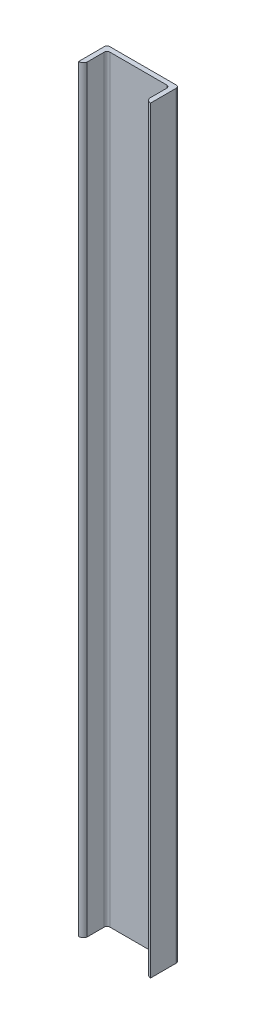
ISO-10303-21;
HEADER;
FILE_DESCRIPTION(('STEP AP214'),'2;1');
FILE_NAME('part.step','',(''),(''),'','','');
FILE_SCHEMA(('AUTOMOTIVE_DESIGN { 1 0 10303 214 1 1 1 1 }'));
ENDSEC;
DATA;
#1=APPLICATION_CONTEXT('core data for automotive mechanical design processes');
#2=APPLICATION_PROTOCOL_DEFINITION('international standard','automotive_design',2000,#1);
#3=PRODUCT_CONTEXT('',#1,'mechanical');
#4=PRODUCT('Part','Part','',(#3));
#5=PRODUCT_RELATED_PRODUCT_CATEGORY('part','',(#4));
#6=PRODUCT_DEFINITION_FORMATION('','',#4);
#7=PRODUCT_DEFINITION_CONTEXT('part definition',#1,'design');
#8=PRODUCT_DEFINITION('design','',#6,#7);
#9=PRODUCT_DEFINITION_SHAPE('','',#8);
#10=(LENGTH_UNIT() NAMED_UNIT(*) SI_UNIT(.MILLI.,.METRE.));
#11=(NAMED_UNIT(*) PLANE_ANGLE_UNIT() SI_UNIT($,.RADIAN.));
#12=(NAMED_UNIT(*) SI_UNIT($,.STERADIAN.) SOLID_ANGLE_UNIT());
#13=UNCERTAINTY_MEASURE_WITH_UNIT(LENGTH_MEASURE(1.E-05),#10,'distance_accuracy_value','');
#14=(GEOMETRIC_REPRESENTATION_CONTEXT(3) GLOBAL_UNCERTAINTY_ASSIGNED_CONTEXT((#13)) GLOBAL_UNIT_ASSIGNED_CONTEXT((#10,
#11,#12)) REPRESENTATION_CONTEXT('',''));
#15=CARTESIAN_POINT('',(0.,0.,0.));
#16=DIRECTION('',(0.,0.,1.));
#17=DIRECTION('',(1.,0.,0.));
#18=AXIS2_PLACEMENT_3D('',#15,#16,#17);
#19=CARTESIAN_POINT('',(38.,800.,-12.1871044980327));
#20=DIRECTION('',(0.,0.,1.));
#21=DIRECTION('',(1.,0.,0.));
#22=AXIS2_PLACEMENT_3D('',#19,#20,#21);
#23=PLANE('',#22);
#24=DIRECTION('',(-1.,0.,0.));
#25=VECTOR('',#24,1.);
#26=CARTESIAN_POINT('',(38.,800.,-12.1871044980327));
#27=LINE('',#26,#25);
#28=CARTESIAN_POINT('',(35.,800.,-12.1871044980327));
#29=VERTEX_POINT('',#28);
#30=CARTESIAN_POINT('',(-35.,800.,-12.1871044980327));
#31=VERTEX_POINT('',#30);
#32=EDGE_CURVE('E131',#29,#31,#27,.T.);
#33=ORIENTED_EDGE('',*,*,#32,.F.);
#34=DIRECTION('',(0.,-1.,0.));
#35=VECTOR('',#34,1.);
#36=CARTESIAN_POINT('',(35.,800.,-12.1871044980327));
#37=LINE('',#36,#35);
#38=CARTESIAN_POINT('',(35.,0.,-12.1871044980327));
#39=VERTEX_POINT('',#38);
#40=EDGE_CURVE('E196',#29,#39,#37,.T.);
#41=ORIENTED_EDGE('',*,*,#40,.T.);
#42=DIRECTION('',(-1.,0.,0.));
#43=VECTOR('',#42,1.);
#44=CARTESIAN_POINT('',(38.,0.,-12.1871044980327));
#45=LINE('',#44,#43);
#46=CARTESIAN_POINT('',(-35.,0.,-12.1871044980327));
#47=VERTEX_POINT('',#46);
#48=EDGE_CURVE('E161',#39,#47,#45,.T.);
#49=ORIENTED_EDGE('',*,*,#48,.T.);
#50=DIRECTION('',(0.,-1.,0.));
#51=VECTOR('',#50,1.);
#52=CARTESIAN_POINT('',(-35.,800.,-12.1871044980327));
#53=LINE('',#52,#51);
#54=EDGE_CURVE('E194',#47,#31,#53,.F.);
#55=ORIENTED_EDGE('',*,*,#54,.T.);
#56=EDGE_LOOP('',(#33,#41,#49,#55));
#57=FACE_BOUND('',#56,.T.);
#58=ADVANCED_FACE('F33',(#57),#23,.F.);
#59=CARTESIAN_POINT('',(-38.,800.,-12.1871044980327));
#60=DIRECTION('',(1.,0.,0.));
#61=DIRECTION('',(0.,0.,-1.));
#62=AXIS2_PLACEMENT_3D('',#59,#60,#61);
#63=PLANE('',#62);
#64=DIRECTION('',(0.,0.,1.));
#65=VECTOR('',#64,1.);
#66=CARTESIAN_POINT('',(-38.,800.,-12.1871044980327));
#67=LINE('',#66,#65);
#68=CARTESIAN_POINT('',(-38.,800.,-9.18710449803274));
#69=VERTEX_POINT('',#68);
#70=CARTESIAN_POINT('',(-38.,800.,17.8128955019673));
#71=VERTEX_POINT('',#70);
#72=EDGE_CURVE('E121',#69,#71,#67,.T.);
#73=ORIENTED_EDGE('',*,*,#72,.F.);
#74=DIRECTION('',(0.,-1.,0.));
#75=VECTOR('',#74,1.);
#76=CARTESIAN_POINT('',(-38.,800.,-9.18710449803274));
#77=LINE('',#76,#75);
#78=CARTESIAN_POINT('',(-38.,0.,-9.18710449803274));
#79=VERTEX_POINT('',#78);
#80=EDGE_CURVE('E207',#69,#79,#77,.T.);
#81=ORIENTED_EDGE('',*,*,#80,.T.);
#82=DIRECTION('',(0.,0.,1.));
#83=VECTOR('',#82,1.);
#84=CARTESIAN_POINT('',(-38.,0.,-12.1871044980327));
#85=LINE('',#84,#83);
#86=CARTESIAN_POINT('',(-38.,0.,17.8128955019673));
#87=VERTEX_POINT('',#86);
#88=EDGE_CURVE('E137',#79,#87,#85,.T.);
#89=ORIENTED_EDGE('',*,*,#88,.T.);
#90=DIRECTION('',(0.,-1.,0.));
#91=VECTOR('',#90,1.);
#92=CARTESIAN_POINT('',(-38.,800.,17.8128955019673));
#93=LINE('',#92,#91);
#94=EDGE_CURVE('E134',#71,#87,#93,.T.);
#95=ORIENTED_EDGE('',*,*,#94,.F.);
#96=EDGE_LOOP('',(#73,#81,#89,#95));
#97=FACE_BOUND('',#96,.T.);
#98=ADVANCED_FACE('F135',(#97),#63,.F.);
#99=CARTESIAN_POINT('',(-38.,800.,12.6822359612341));
#100=DIRECTION('',(0.,-1.,0.));
#101=DIRECTION('',(0.,0.,-1.));
#102=AXIS2_PLACEMENT_3D('',#99,#100,#101);
#103=CYLINDRICAL_SURFACE('',#102,5.13065954073313);
#104=CARTESIAN_POINT('',(-38.,0.,12.6822359612341));
#105=DIRECTION('',(0.,1.,0.));
#106=DIRECTION('',(0.,0.,1.));
#107=AXIS2_PLACEMENT_3D('',#104,#105,#106);
#108=CIRCLE('',#107,5.13065954073313);
#109=CARTESIAN_POINT('',(-33.,0.,13.8327433809911));
#110=VERTEX_POINT('',#109);
#111=EDGE_CURVE('E165',#87,#110,#108,.T.);
#112=ORIENTED_EDGE('',*,*,#111,.T.);
#113=DIRECTION('',(0.,-1.,0.));
#114=VECTOR('',#113,1.);
#115=CARTESIAN_POINT('',(-33.,800.,13.8327433809911));
#116=LINE('',#115,#114);
#117=CARTESIAN_POINT('',(-33.,800.,13.8327433809911));
#118=VERTEX_POINT('',#117);
#119=EDGE_CURVE('E141',#118,#110,#116,.T.);
#120=ORIENTED_EDGE('',*,*,#119,.F.);
#121=CARTESIAN_POINT('',(-38.,800.,12.6822359612341));
#122=DIRECTION('',(0.,1.,0.));
#123=DIRECTION('',(0.,0.,1.));
#124=AXIS2_PLACEMENT_3D('',#121,#122,#123);
#125=CIRCLE('',#124,5.13065954073313);
#126=EDGE_CURVE('E126',#71,#118,#125,.T.);
#127=ORIENTED_EDGE('',*,*,#126,.F.);
#128=ORIENTED_EDGE('',*,*,#94,.T.);
#129=EDGE_LOOP('',(#112,#120,#127,#128));
#130=FACE_BOUND('',#129,.T.);
#131=ADVANCED_FACE('F143',(#130),#103,.T.);
#132=CARTESIAN_POINT('',(-33.,800.,13.8327433809911));
#133=DIRECTION('',(-1.,0.,0.));
#134=DIRECTION('',(0.,0.,1.));
#135=AXIS2_PLACEMENT_3D('',#132,#133,#134);
#136=PLANE('',#135);
#137=DIRECTION('',(0.,0.,-1.));
#138=VECTOR('',#137,1.);
#139=CARTESIAN_POINT('',(-33.,0.,13.8327433809911));
#140=LINE('',#139,#138);
#141=CARTESIAN_POINT('',(-33.,0.,-4.18710449803152));
#142=VERTEX_POINT('',#141);
#143=EDGE_CURVE('E167',#110,#142,#140,.T.);
#144=ORIENTED_EDGE('',*,*,#143,.T.);
#145=DIRECTION('',(0.,-1.,0.));
#146=VECTOR('',#145,1.);
#147=CARTESIAN_POINT('',(-33.,800.,-4.18710449803152));
#148=LINE('',#147,#146);
#149=CARTESIAN_POINT('',(-33.,800.,-4.18710449803152));
#150=VERTEX_POINT('',#149);
#151=EDGE_CURVE('E189',#142,#150,#148,.F.);
#152=ORIENTED_EDGE('',*,*,#151,.T.);
#153=DIRECTION('',(0.,0.,-1.));
#154=VECTOR('',#153,1.);
#155=CARTESIAN_POINT('',(-33.,800.,13.8327433809911));
#156=LINE('',#155,#154);
#157=EDGE_CURVE('E146',#118,#150,#156,.T.);
#158=ORIENTED_EDGE('',*,*,#157,.F.);
#159=ORIENTED_EDGE('',*,*,#119,.T.);
#160=EDGE_LOOP('',(#144,#152,#158,#159));
#161=FACE_BOUND('',#160,.T.);
#162=ADVANCED_FACE('F326',(#161),#136,.F.);
#163=CARTESIAN_POINT('',(33.,800.,-7.18710449803152));
#164=DIRECTION('',(0.,0.,-1.));
#165=DIRECTION('',(-1.,0.,0.));
#166=AXIS2_PLACEMENT_3D('',#163,#164,#165);
#167=PLANE('',#166);
#168=DIRECTION('',(1.,0.,0.));
#169=VECTOR('',#168,1.);
#170=CARTESIAN_POINT('',(33.,800.,-7.18710449803152));
#171=LINE('',#170,#169);
#172=CARTESIAN_POINT('',(-30.,800.,-7.18710449803152));
#173=VERTEX_POINT('',#172);
#174=CARTESIAN_POINT('',(30.,800.,-7.18710449803152));
#175=VERTEX_POINT('',#174);
#176=EDGE_CURVE('E148',#173,#175,#171,.T.);
#177=ORIENTED_EDGE('',*,*,#176,.F.);
#178=DIRECTION('',(0.,-1.,0.));
#179=VECTOR('',#178,1.);
#180=CARTESIAN_POINT('',(-30.,0.,-7.18710449803152));
#181=LINE('',#180,#179);
#182=CARTESIAN_POINT('',(-30.,0.,-7.18710449803152));
#183=VERTEX_POINT('',#182);
#184=EDGE_CURVE('E186',#173,#183,#181,.T.);
#185=ORIENTED_EDGE('',*,*,#184,.T.);
#186=DIRECTION('',(1.,0.,0.));
#187=VECTOR('',#186,1.);
#188=CARTESIAN_POINT('',(33.,0.,-7.18710449803152));
#189=LINE('',#188,#187);
#190=CARTESIAN_POINT('',(30.,0.,-7.18710449803152));
#191=VERTEX_POINT('',#190);
#192=EDGE_CURVE('E170',#183,#191,#189,.T.);
#193=ORIENTED_EDGE('',*,*,#192,.T.);
#194=DIRECTION('',(0.,-1.,0.));
#195=VECTOR('',#194,1.);
#196=CARTESIAN_POINT('',(30.,800.,-7.18710449803152));
#197=LINE('',#196,#195);
#198=EDGE_CURVE('E140',#191,#175,#197,.F.);
#199=ORIENTED_EDGE('',*,*,#198,.T.);
#200=EDGE_LOOP('',(#177,#185,#193,#199));
#201=FACE_BOUND('',#200,.T.);
#202=ADVANCED_FACE('F223',(#201),#167,.F.);
#203=CARTESIAN_POINT('',(33.,800.,13.8327433809911));
#204=DIRECTION('',(1.,0.,0.));
#205=DIRECTION('',(0.,0.,-1.));
#206=AXIS2_PLACEMENT_3D('',#203,#204,#205);
#207=PLANE('',#206);
#208=DIRECTION('',(0.,0.,1.));
#209=VECTOR('',#208,1.);
#210=CARTESIAN_POINT('',(33.,800.,13.8327433809911));
#211=LINE('',#210,#209);
#212=CARTESIAN_POINT('',(33.,800.,-4.18710449803152));
#213=VERTEX_POINT('',#212);
#214=CARTESIAN_POINT('',(33.,800.,13.8327433809911));
#215=VERTEX_POINT('',#214);
#216=EDGE_CURVE('E154',#213,#215,#211,.T.);
#217=ORIENTED_EDGE('',*,*,#216,.F.);
#218=DIRECTION('',(0.,-1.,0.));
#219=VECTOR('',#218,1.);
#220=CARTESIAN_POINT('',(33.,0.,-4.18710449803152));
#221=LINE('',#220,#219);
#222=CARTESIAN_POINT('',(33.,0.,-4.18710449803152));
#223=VERTEX_POINT('',#222);
#224=EDGE_CURVE('E191',#213,#223,#221,.T.);
#225=ORIENTED_EDGE('',*,*,#224,.T.);
#226=DIRECTION('',(0.,0.,1.));
#227=VECTOR('',#226,1.);
#228=CARTESIAN_POINT('',(33.,0.,13.8327433809911));
#229=LINE('',#228,#227);
#230=CARTESIAN_POINT('',(33.,0.,13.8327433809911));
#231=VERTEX_POINT('',#230);
#232=EDGE_CURVE('E173',#223,#231,#229,.T.);
#233=ORIENTED_EDGE('',*,*,#232,.T.);
#234=DIRECTION('',(0.,-1.,0.));
#235=VECTOR('',#234,1.);
#236=CARTESIAN_POINT('',(33.,800.,13.8327433809911));
#237=LINE('',#236,#235);
#238=EDGE_CURVE('E181',#215,#231,#237,.T.);
#239=ORIENTED_EDGE('',*,*,#238,.F.);
#240=EDGE_LOOP('',(#217,#225,#233,#239));
#241=FACE_BOUND('',#240,.T.);
#242=ADVANCED_FACE('F230',(#241),#207,.F.);
#243=CARTESIAN_POINT('',(38.,800.,12.6822359612341));
#244=DIRECTION('',(0.,-1.,0.));
#245=DIRECTION('',(0.,0.,-1.));
#246=AXIS2_PLACEMENT_3D('',#243,#244,#245);
#247=CYLINDRICAL_SURFACE('',#246,5.13065954073313);
#248=CARTESIAN_POINT('',(38.,0.,12.6822359612341));
#249=DIRECTION('',(0.,1.,0.));
#250=DIRECTION('',(0.,0.,-1.));
#251=AXIS2_PLACEMENT_3D('',#248,#249,#250);
#252=CIRCLE('',#251,5.13065954073313);
#253=CARTESIAN_POINT('',(38.,0.,17.8128955019673));
#254=VERTEX_POINT('',#253);
#255=EDGE_CURVE('E175',#231,#254,#252,.T.);
#256=ORIENTED_EDGE('',*,*,#255,.T.);
#257=DIRECTION('',(0.,-1.,0.));
#258=VECTOR('',#257,1.);
#259=CARTESIAN_POINT('',(38.,800.,17.8128955019673));
#260=LINE('',#259,#258);
#261=CARTESIAN_POINT('',(38.,800.,17.8128955019673));
#262=VERTEX_POINT('',#261);
#263=EDGE_CURVE('E160',#262,#254,#260,.T.);
#264=ORIENTED_EDGE('',*,*,#263,.F.);
#265=CARTESIAN_POINT('',(38.,800.,12.6822359612341));
#266=DIRECTION('',(0.,1.,0.));
#267=DIRECTION('',(0.,0.,-1.));
#268=AXIS2_PLACEMENT_3D('',#265,#266,#267);
#269=CIRCLE('',#268,5.13065954073313);
#270=EDGE_CURVE('E156',#215,#262,#269,.T.);
#271=ORIENTED_EDGE('',*,*,#270,.F.);
#272=ORIENTED_EDGE('',*,*,#238,.T.);
#273=EDGE_LOOP('',(#256,#264,#271,#272));
#274=FACE_BOUND('',#273,.T.);
#275=ADVANCED_FACE('F234',(#274),#247,.T.);
#276=CARTESIAN_POINT('',(38.,800.,-12.1871044980327));
#277=DIRECTION('',(-1.,0.,0.));
#278=DIRECTION('',(0.,0.,1.));
#279=AXIS2_PLACEMENT_3D('',#276,#277,#278);
#280=PLANE('',#279);
#281=DIRECTION('',(0.,0.,-1.));
#282=VECTOR('',#281,1.);
#283=CARTESIAN_POINT('',(38.,0.,-12.1871044980327));
#284=LINE('',#283,#282);
#285=CARTESIAN_POINT('',(38.,0.,-9.18710449803274));
#286=VERTEX_POINT('',#285);
#287=EDGE_CURVE('E177',#254,#286,#284,.T.);
#288=ORIENTED_EDGE('',*,*,#287,.T.);
#289=DIRECTION('',(0.,-1.,0.));
#290=VECTOR('',#289,1.);
#291=CARTESIAN_POINT('',(38.,800.,-9.18710449803274));
#292=LINE('',#291,#290);
#293=CARTESIAN_POINT('',(38.,800.,-9.18710449803274));
#294=VERTEX_POINT('',#293);
#295=EDGE_CURVE('E56',#286,#294,#292,.F.);
#296=ORIENTED_EDGE('',*,*,#295,.T.);
#297=DIRECTION('',(0.,0.,-1.));
#298=VECTOR('',#297,1.);
#299=CARTESIAN_POINT('',(38.,800.,-12.1871044980327));
#300=LINE('',#299,#298);
#301=EDGE_CURVE('E158',#262,#294,#300,.T.);
#302=ORIENTED_EDGE('',*,*,#301,.F.);
#303=ORIENTED_EDGE('',*,*,#263,.T.);
#304=EDGE_LOOP('',(#288,#296,#302,#303));
#305=FACE_BOUND('',#304,.T.);
#306=ADVANCED_FACE('F296',(#305),#280,.F.);
#307=CARTESIAN_POINT('',(-38.,800.,12.6822359612341));
#308=DIRECTION('',(0.,1.,0.));
#309=DIRECTION('',(0.,0.,1.));
#310=AXIS2_PLACEMENT_3D('',#307,#308,#309);
#311=PLANE('',#310);
#312=ORIENTED_EDGE('',*,*,#301,.T.);
#313=CARTESIAN_POINT('',(35.,800.,-9.18710449803274));
#314=DIRECTION('',(0.,1.,0.));
#315=DIRECTION('',(0.,0.,1.));
#316=AXIS2_PLACEMENT_3D('',#313,#314,#315);
#317=CIRCLE('',#316,3.);
#318=EDGE_CURVE('E205',#294,#29,#317,.T.);
#319=ORIENTED_EDGE('',*,*,#318,.T.);
#320=ORIENTED_EDGE('',*,*,#32,.T.);
#321=CARTESIAN_POINT('',(-35.,800.,-9.18710449803274));
#322=DIRECTION('',(0.,1.,0.));
#323=DIRECTION('',(0.,0.,1.));
#324=AXIS2_PLACEMENT_3D('',#321,#322,#323);
#325=CIRCLE('',#324,3.);
#326=EDGE_CURVE('E48',#31,#69,#325,.T.);
#327=ORIENTED_EDGE('',*,*,#326,.T.);
#328=ORIENTED_EDGE('',*,*,#72,.T.);
#329=ORIENTED_EDGE('',*,*,#126,.T.);
#330=ORIENTED_EDGE('',*,*,#157,.T.);
#331=CARTESIAN_POINT('',(-30.,800.,-4.18710449803152));
#332=DIRECTION('',(0.,1.,0.));
#333=DIRECTION('',(0.,0.,1.));
#334=AXIS2_PLACEMENT_3D('',#331,#332,#333);
#335=CIRCLE('',#334,3.);
#336=EDGE_CURVE('E211',#150,#173,#335,.F.);
#337=ORIENTED_EDGE('',*,*,#336,.T.);
#338=ORIENTED_EDGE('',*,*,#176,.T.);
#339=CARTESIAN_POINT('',(30.,800.,-4.18710449803152));
#340=DIRECTION('',(0.,1.,0.));
#341=DIRECTION('',(0.,0.,1.));
#342=AXIS2_PLACEMENT_3D('',#339,#340,#341);
#343=CIRCLE('',#342,3.);
#344=EDGE_CURVE('E11',#175,#213,#343,.F.);
#345=ORIENTED_EDGE('',*,*,#344,.T.);
#346=ORIENTED_EDGE('',*,*,#216,.T.);
#347=ORIENTED_EDGE('',*,*,#270,.T.);
#348=EDGE_LOOP('',(#312,#319,#320,#327,#328,#329,#330,#337,#338,#345,#346,#347));
#349=FACE_BOUND('',#348,.T.);
#350=ADVANCED_FACE('F123',(#349),#311,.T.);
#351=CARTESIAN_POINT('',(-38.,0.,12.6822359612341));
#352=DIRECTION('',(0.,1.,0.));
#353=DIRECTION('',(0.,0.,1.));
#354=AXIS2_PLACEMENT_3D('',#351,#352,#353);
#355=PLANE('',#354);
#356=ORIENTED_EDGE('',*,*,#48,.F.);
#357=CARTESIAN_POINT('',(35.,0.,-9.18710449803274));
#358=DIRECTION('',(0.,1.,0.));
#359=DIRECTION('',(0.,0.,1.));
#360=AXIS2_PLACEMENT_3D('',#357,#358,#359);
#361=CIRCLE('',#360,3.);
#362=EDGE_CURVE('E201',#39,#286,#361,.F.);
#363=ORIENTED_EDGE('',*,*,#362,.T.);
#364=ORIENTED_EDGE('',*,*,#287,.F.);
#365=ORIENTED_EDGE('',*,*,#255,.F.);
#366=ORIENTED_EDGE('',*,*,#232,.F.);
#367=CARTESIAN_POINT('',(30.,0.,-4.18710449803152));
#368=DIRECTION('',(0.,1.,0.));
#369=DIRECTION('',(0.,0.,1.));
#370=AXIS2_PLACEMENT_3D('',#367,#368,#369);
#371=CIRCLE('',#370,3.);
#372=EDGE_CURVE('E41',#223,#191,#371,.T.);
#373=ORIENTED_EDGE('',*,*,#372,.T.);
#374=ORIENTED_EDGE('',*,*,#192,.F.);
#375=CARTESIAN_POINT('',(-30.,0.,-4.18710449803152));
#376=DIRECTION('',(0.,1.,0.));
#377=DIRECTION('',(0.,0.,1.));
#378=AXIS2_PLACEMENT_3D('',#375,#376,#377);
#379=CIRCLE('',#378,3.);
#380=EDGE_CURVE('E209',#183,#142,#379,.T.);
#381=ORIENTED_EDGE('',*,*,#380,.T.);
#382=ORIENTED_EDGE('',*,*,#143,.F.);
#383=ORIENTED_EDGE('',*,*,#111,.F.);
#384=ORIENTED_EDGE('',*,*,#88,.F.);
#385=CARTESIAN_POINT('',(-35.,0.,-9.18710449803274));
#386=DIRECTION('',(0.,1.,0.));
#387=DIRECTION('',(0.,0.,1.));
#388=AXIS2_PLACEMENT_3D('',#385,#386,#387);
#389=CIRCLE('',#388,3.);
#390=EDGE_CURVE('E199',#79,#47,#389,.F.);
#391=ORIENTED_EDGE('',*,*,#390,.T.);
#392=EDGE_LOOP('',(#356,#363,#364,#365,#366,#373,#374,#381,#382,#383,#384,#391));
#393=FACE_BOUND('',#392,.T.);
#394=ADVANCED_FACE('F216',(#393),#355,.F.);
#395=CARTESIAN_POINT('',(-30.,800.,-4.18710449803152));
#396=DIRECTION('',(0.,1.,0.));
#397=DIRECTION('',(0.,0.,1.));
#398=AXIS2_PLACEMENT_3D('',#395,#396,#397);
#399=CYLINDRICAL_SURFACE('',#398,3.);
#400=ORIENTED_EDGE('',*,*,#336,.F.);
#401=ORIENTED_EDGE('',*,*,#151,.F.);
#402=ORIENTED_EDGE('',*,*,#380,.F.);
#403=ORIENTED_EDGE('',*,*,#184,.F.);
#404=EDGE_LOOP('',(#400,#401,#402,#403));
#405=FACE_BOUND('',#404,.T.);
#406=ADVANCED_FACE('F256',(#405),#399,.F.);
#407=CARTESIAN_POINT('',(30.,800.,-4.18710449803152));
#408=DIRECTION('',(0.,1.,0.));
#409=DIRECTION('',(0.,0.,1.));
#410=AXIS2_PLACEMENT_3D('',#407,#408,#409);
#411=CYLINDRICAL_SURFACE('',#410,3.);
#412=ORIENTED_EDGE('',*,*,#344,.F.);
#413=ORIENTED_EDGE('',*,*,#198,.F.);
#414=ORIENTED_EDGE('',*,*,#372,.F.);
#415=ORIENTED_EDGE('',*,*,#224,.F.);
#416=EDGE_LOOP('',(#412,#413,#414,#415));
#417=FACE_BOUND('',#416,.T.);
#418=ADVANCED_FACE('F226',(#417),#411,.F.);
#419=CARTESIAN_POINT('',(35.,800.,-9.18710449803274));
#420=DIRECTION('',(0.,-1.,0.));
#421=DIRECTION('',(0.,0.,-1.));
#422=AXIS2_PLACEMENT_3D('',#419,#420,#421);
#423=CYLINDRICAL_SURFACE('',#422,3.);
#424=ORIENTED_EDGE('',*,*,#318,.F.);
#425=ORIENTED_EDGE('',*,*,#295,.F.);
#426=ORIENTED_EDGE('',*,*,#362,.F.);
#427=ORIENTED_EDGE('',*,*,#40,.F.);
#428=EDGE_LOOP('',(#424,#425,#426,#427));
#429=FACE_BOUND('',#428,.T.);
#430=ADVANCED_FACE('F239',(#429),#423,.T.);
#431=CARTESIAN_POINT('',(-35.,800.,-9.18710449803274));
#432=DIRECTION('',(0.,-1.,0.));
#433=DIRECTION('',(0.,0.,-1.));
#434=AXIS2_PLACEMENT_3D('',#431,#432,#433);
#435=CYLINDRICAL_SURFACE('',#434,3.);
#436=ORIENTED_EDGE('',*,*,#326,.F.);
#437=ORIENTED_EDGE('',*,*,#54,.F.);
#438=ORIENTED_EDGE('',*,*,#390,.F.);
#439=ORIENTED_EDGE('',*,*,#80,.F.);
#440=EDGE_LOOP('',(#436,#437,#438,#439));
#441=FACE_BOUND('',#440,.T.);
#442=ADVANCED_FACE('F35',(#441),#435,.T.);
#443=CLOSED_SHELL('',(#58,#98,#131,#162,#202,#242,#275,#306,#350,#394,#406,#418,#430,#442));
#444=MANIFOLD_SOLID_BREP('B2',#443);
#445=ADVANCED_BREP_SHAPE_REPRESENTATION('',(#18,#444),#14);
#446=SHAPE_DEFINITION_REPRESENTATION(#9,#445);
ENDSEC;
END-ISO-10303-21;
